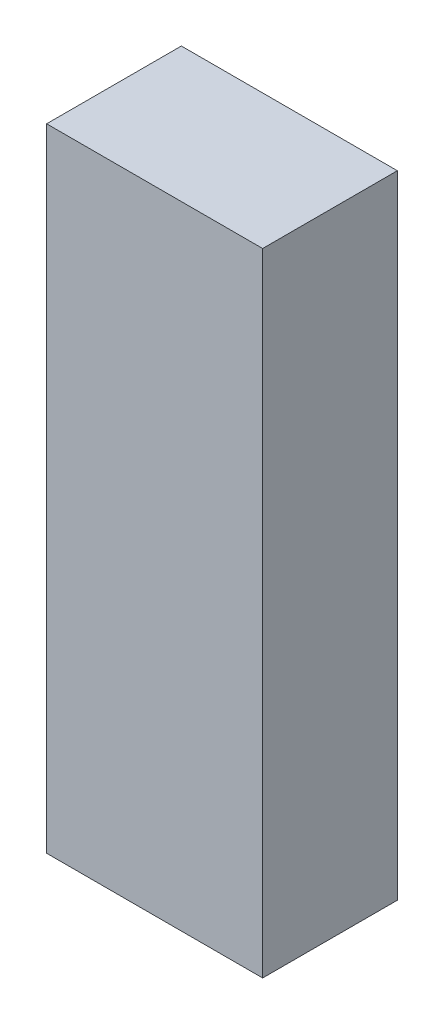
ISO-10303-21;
HEADER;
FILE_DESCRIPTION(('STEP AP214'),'2;1');
FILE_NAME('part.step','',(''),(''),'','','');
FILE_SCHEMA(('AUTOMOTIVE_DESIGN { 1 0 10303 214 1 1 1 1 }'));
ENDSEC;
DATA;
#1=APPLICATION_CONTEXT('core data for automotive mechanical design processes');
#2=APPLICATION_PROTOCOL_DEFINITION('international standard','automotive_design',2000,#1);
#3=PRODUCT_CONTEXT('',#1,'mechanical');
#4=PRODUCT('Part','Part','',(#3));
#5=PRODUCT_RELATED_PRODUCT_CATEGORY('part','',(#4));
#6=PRODUCT_DEFINITION_FORMATION('','',#4);
#7=PRODUCT_DEFINITION_CONTEXT('part definition',#1,'design');
#8=PRODUCT_DEFINITION('design','',#6,#7);
#9=PRODUCT_DEFINITION_SHAPE('','',#8);
#10=(LENGTH_UNIT() NAMED_UNIT(*) SI_UNIT(.MILLI.,.METRE.));
#11=(NAMED_UNIT(*) PLANE_ANGLE_UNIT() SI_UNIT($,.RADIAN.));
#12=(NAMED_UNIT(*) SI_UNIT($,.STERADIAN.) SOLID_ANGLE_UNIT());
#13=UNCERTAINTY_MEASURE_WITH_UNIT(LENGTH_MEASURE(1.E-05),#10,'distance_accuracy_value','');
#14=(GEOMETRIC_REPRESENTATION_CONTEXT(3) GLOBAL_UNCERTAINTY_ASSIGNED_CONTEXT((#13)) GLOBAL_UNIT_ASSIGNED_CONTEXT((#10,
#11,#12)) REPRESENTATION_CONTEXT('',''));
#15=CARTESIAN_POINT('',(0.,0.,0.));
#16=DIRECTION('',(0.,0.,1.));
#17=DIRECTION('',(1.,0.,0.));
#18=AXIS2_PLACEMENT_3D('',#15,#16,#17);
#19=CARTESIAN_POINT('',(0.,0.,29.));
#20=DIRECTION('',(0.,0.,1.));
#21=DIRECTION('',(1.,0.,0.));
#22=AXIS2_PLACEMENT_3D('',#19,#20,#21);
#23=PLANE('',#22);
#24=DIRECTION('',(0.,-1.,0.));
#25=VECTOR('',#24,1.);
#26=CARTESIAN_POINT('',(-23.25,68.,29.));
#27=LINE('',#26,#25);
#28=CARTESIAN_POINT('',(-23.25,68.,29.));
#29=VERTEX_POINT('',#28);
#30=CARTESIAN_POINT('',(-23.25,-68.,29.));
#31=VERTEX_POINT('',#30);
#32=EDGE_CURVE('E85',#29,#31,#27,.T.);
#33=ORIENTED_EDGE('',*,*,#32,.T.);
#34=DIRECTION('',(1.,0.,0.));
#35=VECTOR('',#34,1.);
#36=CARTESIAN_POINT('',(-23.25,-68.,29.));
#37=LINE('',#36,#35);
#38=CARTESIAN_POINT('',(23.25,-68.,29.));
#39=VERTEX_POINT('',#38);
#40=EDGE_CURVE('E71',#31,#39,#37,.T.);
#41=ORIENTED_EDGE('',*,*,#40,.T.);
#42=DIRECTION('',(0.,1.,0.));
#43=VECTOR('',#42,1.);
#44=CARTESIAN_POINT('',(23.25,-68.,29.));
#45=LINE('',#44,#43);
#46=CARTESIAN_POINT('',(23.25,68.,29.));
#47=VERTEX_POINT('',#46);
#48=EDGE_CURVE('E107',#39,#47,#45,.T.);
#49=ORIENTED_EDGE('',*,*,#48,.T.);
#50=DIRECTION('',(-1.,0.,0.));
#51=VECTOR('',#50,1.);
#52=CARTESIAN_POINT('',(23.25,68.,29.));
#53=LINE('',#52,#51);
#54=EDGE_CURVE('E10',#47,#29,#53,.T.);
#55=ORIENTED_EDGE('',*,*,#54,.T.);
#56=EDGE_LOOP('',(#33,#41,#49,#55));
#57=FACE_BOUND('',#56,.T.);
#58=ADVANCED_FACE('F15',(#57),#23,.T.);
#59=CARTESIAN_POINT('',(0.,0.,0.));
#60=DIRECTION('',(0.,0.,1.));
#61=DIRECTION('',(1.,0.,0.));
#62=AXIS2_PLACEMENT_3D('',#59,#60,#61);
#63=PLANE('',#62);
#64=DIRECTION('',(-1.,0.,0.));
#65=VECTOR('',#64,1.);
#66=CARTESIAN_POINT('',(23.25,68.,0.));
#67=LINE('',#66,#65);
#68=CARTESIAN_POINT('',(23.25,68.,0.));
#69=VERTEX_POINT('',#68);
#70=CARTESIAN_POINT('',(-23.25,68.,0.));
#71=VERTEX_POINT('',#70);
#72=EDGE_CURVE('E25',#69,#71,#67,.T.);
#73=ORIENTED_EDGE('',*,*,#72,.F.);
#74=DIRECTION('',(0.,1.,0.));
#75=VECTOR('',#74,1.);
#76=CARTESIAN_POINT('',(23.25,-68.,0.));
#77=LINE('',#76,#75);
#78=CARTESIAN_POINT('',(23.25,-68.,0.));
#79=VERTEX_POINT('',#78);
#80=EDGE_CURVE('E82',#79,#69,#77,.T.);
#81=ORIENTED_EDGE('',*,*,#80,.F.);
#82=DIRECTION('',(1.,0.,0.));
#83=VECTOR('',#82,1.);
#84=CARTESIAN_POINT('',(-23.25,-68.,0.));
#85=LINE('',#84,#83);
#86=CARTESIAN_POINT('',(-23.25,-68.,0.));
#87=VERTEX_POINT('',#86);
#88=EDGE_CURVE('E102',#87,#79,#85,.T.);
#89=ORIENTED_EDGE('',*,*,#88,.F.);
#90=DIRECTION('',(0.,-1.,0.));
#91=VECTOR('',#90,1.);
#92=CARTESIAN_POINT('',(-23.25,68.,0.));
#93=LINE('',#92,#91);
#94=EDGE_CURVE('E92',#71,#87,#93,.T.);
#95=ORIENTED_EDGE('',*,*,#94,.F.);
#96=EDGE_LOOP('',(#73,#81,#89,#95));
#97=FACE_BOUND('',#96,.T.);
#98=ADVANCED_FACE('F17',(#97),#63,.F.);
#99=CARTESIAN_POINT('',(23.25,68.,0.));
#100=DIRECTION('',(0.,-1.,0.));
#101=DIRECTION('',(0.,0.,-1.));
#102=AXIS2_PLACEMENT_3D('',#99,#100,#101);
#103=PLANE('',#102);
#104=ORIENTED_EDGE('',*,*,#72,.T.);
#105=DIRECTION('',(0.,0.,1.));
#106=VECTOR('',#105,1.);
#107=CARTESIAN_POINT('',(-23.25,68.,0.));
#108=LINE('',#107,#106);
#109=EDGE_CURVE('E89',#71,#29,#108,.T.);
#110=ORIENTED_EDGE('',*,*,#109,.T.);
#111=ORIENTED_EDGE('',*,*,#54,.F.);
#112=DIRECTION('',(0.,0.,1.));
#113=VECTOR('',#112,1.);
#114=CARTESIAN_POINT('',(23.25,68.,0.));
#115=LINE('',#114,#113);
#116=EDGE_CURVE('E19',#69,#47,#115,.T.);
#117=ORIENTED_EDGE('',*,*,#116,.F.);
#118=EDGE_LOOP('',(#104,#110,#111,#117));
#119=FACE_BOUND('',#118,.T.);
#120=ADVANCED_FACE('F118',(#119),#103,.F.);
#121=CARTESIAN_POINT('',(23.25,-68.,0.));
#122=DIRECTION('',(-1.,0.,0.));
#123=DIRECTION('',(0.,0.,1.));
#124=AXIS2_PLACEMENT_3D('',#121,#122,#123);
#125=PLANE('',#124);
#126=ORIENTED_EDGE('',*,*,#80,.T.);
#127=ORIENTED_EDGE('',*,*,#116,.T.);
#128=ORIENTED_EDGE('',*,*,#48,.F.);
#129=DIRECTION('',(0.,0.,1.));
#130=VECTOR('',#129,1.);
#131=CARTESIAN_POINT('',(23.25,-68.,0.));
#132=LINE('',#131,#130);
#133=EDGE_CURVE('E79',#79,#39,#132,.T.);
#134=ORIENTED_EDGE('',*,*,#133,.F.);
#135=EDGE_LOOP('',(#126,#127,#128,#134));
#136=FACE_BOUND('',#135,.T.);
#137=ADVANCED_FACE('F117',(#136),#125,.F.);
#138=CARTESIAN_POINT('',(-23.25,-68.,0.));
#139=DIRECTION('',(0.,1.,0.));
#140=DIRECTION('',(1.,0.,0.));
#141=AXIS2_PLACEMENT_3D('',#138,#139,#140);
#142=PLANE('',#141);
#143=ORIENTED_EDGE('',*,*,#88,.T.);
#144=ORIENTED_EDGE('',*,*,#133,.T.);
#145=ORIENTED_EDGE('',*,*,#40,.F.);
#146=DIRECTION('',(0.,0.,1.));
#147=VECTOR('',#146,1.);
#148=CARTESIAN_POINT('',(-23.25,-68.,0.));
#149=LINE('',#148,#147);
#150=EDGE_CURVE('E76',#87,#31,#149,.T.);
#151=ORIENTED_EDGE('',*,*,#150,.F.);
#152=EDGE_LOOP('',(#143,#144,#145,#151));
#153=FACE_BOUND('',#152,.T.);
#154=ADVANCED_FACE('F74',(#153),#142,.F.);
#155=CARTESIAN_POINT('',(-23.25,68.,0.));
#156=DIRECTION('',(1.,0.,0.));
#157=DIRECTION('',(0.,1.,0.));
#158=AXIS2_PLACEMENT_3D('',#155,#156,#157);
#159=PLANE('',#158);
#160=ORIENTED_EDGE('',*,*,#94,.T.);
#161=ORIENTED_EDGE('',*,*,#150,.T.);
#162=ORIENTED_EDGE('',*,*,#32,.F.);
#163=ORIENTED_EDGE('',*,*,#109,.F.);
#164=EDGE_LOOP('',(#160,#161,#162,#163));
#165=FACE_BOUND('',#164,.T.);
#166=ADVANCED_FACE('F91',(#165),#159,.F.);
#167=CLOSED_SHELL('',(#58,#98,#120,#137,#154,#166));
#168=MANIFOLD_SOLID_BREP('B1',#167);
#169=ADVANCED_BREP_SHAPE_REPRESENTATION('',(#18,#168),#14);
#170=SHAPE_DEFINITION_REPRESENTATION(#9,#169);
ENDSEC;
END-ISO-10303-21;
